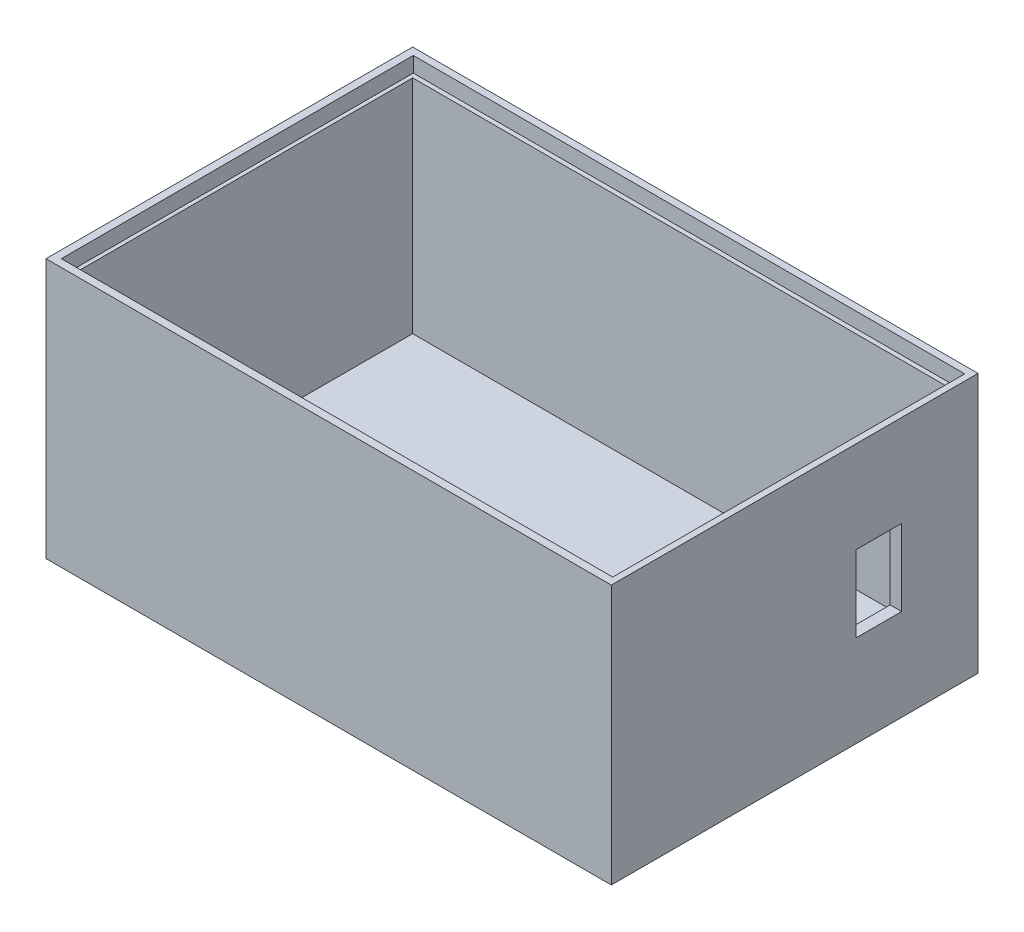
ISO-10303-21;
HEADER;
FILE_DESCRIPTION(('STEP AP214'),'2;1');
FILE_NAME('part.step','',(''),(''),'','','');
FILE_SCHEMA(('AUTOMOTIVE_DESIGN { 1 0 10303 214 1 1 1 1 }'));
ENDSEC;
DATA;
#1=APPLICATION_CONTEXT('core data for automotive mechanical design processes');
#2=APPLICATION_PROTOCOL_DEFINITION('international standard','automotive_design',2000,#1);
#3=PRODUCT_CONTEXT('',#1,'mechanical');
#4=PRODUCT('Part','Part','',(#3));
#5=PRODUCT_RELATED_PRODUCT_CATEGORY('part','',(#4));
#6=PRODUCT_DEFINITION_FORMATION('','',#4);
#7=PRODUCT_DEFINITION_CONTEXT('part definition',#1,'design');
#8=PRODUCT_DEFINITION('design','',#6,#7);
#9=PRODUCT_DEFINITION_SHAPE('','',#8);
#10=(LENGTH_UNIT() NAMED_UNIT(*) SI_UNIT(.MILLI.,.METRE.));
#11=(NAMED_UNIT(*) PLANE_ANGLE_UNIT() SI_UNIT($,.RADIAN.));
#12=(NAMED_UNIT(*) SI_UNIT($,.STERADIAN.) SOLID_ANGLE_UNIT());
#13=UNCERTAINTY_MEASURE_WITH_UNIT(LENGTH_MEASURE(1.E-05),#10,'distance_accuracy_value','');
#14=(GEOMETRIC_REPRESENTATION_CONTEXT(3) GLOBAL_UNCERTAINTY_ASSIGNED_CONTEXT((#13)) GLOBAL_UNIT_ASSIGNED_CONTEXT((#10,
#11,#12)) REPRESENTATION_CONTEXT('',''));
#15=CARTESIAN_POINT('',(0.,0.,0.));
#16=DIRECTION('',(0.,0.,1.));
#17=DIRECTION('',(1.,0.,0.));
#18=AXIS2_PLACEMENT_3D('',#15,#16,#17);
#19=CARTESIAN_POINT('',(37.,34.,24.));
#20=DIRECTION('',(-1.,0.,0.));
#21=DIRECTION('',(0.,0.,1.));
#22=AXIS2_PLACEMENT_3D('',#19,#20,#21);
#23=PLANE('',#22);
#24=DIRECTION('',(0.,0.,-1.));
#25=VECTOR('',#24,1.);
#26=CARTESIAN_POINT('',(37.,12.,-8.));
#27=LINE('',#26,#25);
#28=CARTESIAN_POINT('',(37.,12.,-8.));
#29=VERTEX_POINT('',#28);
#30=CARTESIAN_POINT('',(37.,12.,-14.));
#31=VERTEX_POINT('',#30);
#32=EDGE_CURVE('E165',#29,#31,#27,.T.);
#33=ORIENTED_EDGE('',*,*,#32,.F.);
#34=DIRECTION('',(0.,-1.,0.));
#35=VECTOR('',#34,1.);
#36=CARTESIAN_POINT('',(37.,22.,-8.));
#37=LINE('',#36,#35);
#38=CARTESIAN_POINT('',(37.,22.,-8.));
#39=VERTEX_POINT('',#38);
#40=EDGE_CURVE('E55',#39,#29,#37,.T.);
#41=ORIENTED_EDGE('',*,*,#40,.F.);
#42=DIRECTION('',(0.,0.,1.));
#43=VECTOR('',#42,1.);
#44=CARTESIAN_POINT('',(37.,22.,-8.));
#45=LINE('',#44,#43);
#46=CARTESIAN_POINT('',(37.,22.,-14.));
#47=VERTEX_POINT('',#46);
#48=EDGE_CURVE('E169',#47,#39,#45,.T.);
#49=ORIENTED_EDGE('',*,*,#48,.F.);
#50=DIRECTION('',(0.,1.,0.));
#51=VECTOR('',#50,1.);
#52=CARTESIAN_POINT('',(37.,22.,-14.));
#53=LINE('',#52,#51);
#54=EDGE_CURVE('E153',#31,#47,#53,.T.);
#55=ORIENTED_EDGE('',*,*,#54,.F.);
#56=EDGE_LOOP('',(#33,#41,#49,#55));
#57=FACE_BOUND('',#56,.T.);
#58=DIRECTION('',(0.,0.,-1.));
#59=VECTOR('',#58,1.);
#60=CARTESIAN_POINT('',(37.,0.,24.));
#61=LINE('',#60,#59);
#62=CARTESIAN_POINT('',(37.,0.,24.));
#63=VERTEX_POINT('',#62);
#64=CARTESIAN_POINT('',(37.,0.,-24.));
#65=VERTEX_POINT('',#64);
#66=EDGE_CURVE('E233',#63,#65,#61,.T.);
#67=ORIENTED_EDGE('',*,*,#66,.T.);
#68=DIRECTION('',(0.,-1.,0.));
#69=VECTOR('',#68,1.);
#70=CARTESIAN_POINT('',(37.,34.,-24.));
#71=LINE('',#70,#69);
#72=CARTESIAN_POINT('',(37.,34.,-24.));
#73=VERTEX_POINT('',#72);
#74=EDGE_CURVE('E267',#73,#65,#71,.T.);
#75=ORIENTED_EDGE('',*,*,#74,.F.);
#76=DIRECTION('',(0.,0.,-1.));
#77=VECTOR('',#76,1.);
#78=CARTESIAN_POINT('',(37.,34.,24.));
#79=LINE('',#78,#77);
#80=CARTESIAN_POINT('',(37.,34.,24.));
#81=VERTEX_POINT('',#80);
#82=EDGE_CURVE('E242',#81,#73,#79,.T.);
#83=ORIENTED_EDGE('',*,*,#82,.F.);
#84=DIRECTION('',(0.,-1.,0.));
#85=VECTOR('',#84,1.);
#86=CARTESIAN_POINT('',(37.,34.,24.));
#87=LINE('',#86,#85);
#88=EDGE_CURVE('E251',#81,#63,#87,.T.);
#89=ORIENTED_EDGE('',*,*,#88,.T.);
#90=EDGE_LOOP('',(#67,#75,#83,#89));
#91=FACE_BOUND('',#90,.T.);
#92=ADVANCED_FACE('F36',(#57,#91),#23,.F.);
#93=CARTESIAN_POINT('',(-37.,34.,-24.));
#94=DIRECTION('',(0.,0.,1.));
#95=DIRECTION('',(1.,0.,0.));
#96=AXIS2_PLACEMENT_3D('',#93,#94,#95);
#97=PLANE('',#96);
#98=DIRECTION('',(-1.,0.,0.));
#99=VECTOR('',#98,1.);
#100=CARTESIAN_POINT('',(-37.,0.,-24.));
#101=LINE('',#100,#99);
#102=CARTESIAN_POINT('',(-37.,0.,-24.));
#103=VERTEX_POINT('',#102);
#104=EDGE_CURVE('E258',#65,#103,#101,.T.);
#105=ORIENTED_EDGE('',*,*,#104,.T.);
#106=DIRECTION('',(0.,-1.,0.));
#107=VECTOR('',#106,1.);
#108=CARTESIAN_POINT('',(-37.,34.,-24.));
#109=LINE('',#108,#107);
#110=CARTESIAN_POINT('',(-37.,34.,-24.));
#111=VERTEX_POINT('',#110);
#112=EDGE_CURVE('E266',#111,#103,#109,.T.);
#113=ORIENTED_EDGE('',*,*,#112,.F.);
#114=DIRECTION('',(-1.,0.,0.));
#115=VECTOR('',#114,1.);
#116=CARTESIAN_POINT('',(-37.,34.,-24.));
#117=LINE('',#116,#115);
#118=EDGE_CURVE('E247',#73,#111,#117,.T.);
#119=ORIENTED_EDGE('',*,*,#118,.F.);
#120=ORIENTED_EDGE('',*,*,#74,.T.);
#121=EDGE_LOOP('',(#105,#113,#119,#120));
#122=FACE_BOUND('',#121,.T.);
#123=ADVANCED_FACE('F300',(#122),#97,.F.);
#124=CARTESIAN_POINT('',(-37.,34.,24.));
#125=DIRECTION('',(1.,0.,0.));
#126=DIRECTION('',(0.,0.,-1.));
#127=AXIS2_PLACEMENT_3D('',#124,#125,#126);
#128=PLANE('',#127);
#129=DIRECTION('',(0.,0.,1.));
#130=VECTOR('',#129,1.);
#131=CARTESIAN_POINT('',(-37.,0.,24.));
#132=LINE('',#131,#130);
#133=CARTESIAN_POINT('',(-37.,0.,24.));
#134=VERTEX_POINT('',#133);
#135=EDGE_CURVE('E256',#103,#134,#132,.T.);
#136=ORIENTED_EDGE('',*,*,#135,.T.);
#137=DIRECTION('',(0.,-1.,0.));
#138=VECTOR('',#137,1.);
#139=CARTESIAN_POINT('',(-37.,34.,24.));
#140=LINE('',#139,#138);
#141=CARTESIAN_POINT('',(-37.,34.,24.));
#142=VERTEX_POINT('',#141);
#143=EDGE_CURVE('E263',#142,#134,#140,.T.);
#144=ORIENTED_EDGE('',*,*,#143,.F.);
#145=DIRECTION('',(0.,0.,1.));
#146=VECTOR('',#145,1.);
#147=CARTESIAN_POINT('',(-37.,34.,24.));
#148=LINE('',#147,#146);
#149=EDGE_CURVE('E246',#111,#142,#148,.T.);
#150=ORIENTED_EDGE('',*,*,#149,.F.);
#151=ORIENTED_EDGE('',*,*,#112,.T.);
#152=EDGE_LOOP('',(#136,#144,#150,#151));
#153=FACE_BOUND('',#152,.T.);
#154=ADVANCED_FACE('F305',(#153),#128,.F.);
#155=CARTESIAN_POINT('',(-37.,34.,24.));
#156=DIRECTION('',(0.,0.,-1.));
#157=DIRECTION('',(-1.,0.,0.));
#158=AXIS2_PLACEMENT_3D('',#155,#156,#157);
#159=PLANE('',#158);
#160=DIRECTION('',(1.,0.,0.));
#161=VECTOR('',#160,1.);
#162=CARTESIAN_POINT('',(-37.,0.,24.));
#163=LINE('',#162,#161);
#164=EDGE_CURVE('E250',#134,#63,#163,.T.);
#165=ORIENTED_EDGE('',*,*,#164,.T.);
#166=ORIENTED_EDGE('',*,*,#88,.F.);
#167=DIRECTION('',(1.,0.,0.));
#168=VECTOR('',#167,1.);
#169=CARTESIAN_POINT('',(-37.,34.,24.));
#170=LINE('',#169,#168);
#171=EDGE_CURVE('E253',#142,#81,#170,.T.);
#172=ORIENTED_EDGE('',*,*,#171,.F.);
#173=ORIENTED_EDGE('',*,*,#143,.T.);
#174=EDGE_LOOP('',(#165,#166,#172,#173));
#175=FACE_BOUND('',#174,.T.);
#176=ADVANCED_FACE('F307',(#175),#159,.F.);
#177=CARTESIAN_POINT('',(0.,34.,0.));
#178=DIRECTION('',(0.,-1.,0.));
#179=DIRECTION('',(0.,0.,-1.));
#180=AXIS2_PLACEMENT_3D('',#177,#178,#179);
#181=PLANE('',#180);
#182=DIRECTION('',(1.,0.,0.));
#183=VECTOR('',#182,1.);
#184=CARTESIAN_POINT('',(-36.,34.,23.));
#185=LINE('',#184,#183);
#186=CARTESIAN_POINT('',(-36.,34.,23.));
#187=VERTEX_POINT('',#186);
#188=CARTESIAN_POINT('',(36.1855355612655,34.,23.));
#189=VERTEX_POINT('',#188);
#190=EDGE_CURVE('E194',#187,#189,#185,.T.);
#191=ORIENTED_EDGE('',*,*,#190,.F.);
#192=DIRECTION('',(0.,0.,1.));
#193=VECTOR('',#192,1.);
#194=CARTESIAN_POINT('',(-36.,34.,23.));
#195=LINE('',#194,#193);
#196=CARTESIAN_POINT('',(-36.,34.,-23.0800933434018));
#197=VERTEX_POINT('',#196);
#198=EDGE_CURVE('E174',#197,#187,#195,.T.);
#199=ORIENTED_EDGE('',*,*,#198,.F.);
#200=DIRECTION('',(-1.,0.,0.));
#201=VECTOR('',#200,1.);
#202=CARTESIAN_POINT('',(-36.,34.,-23.0800933434018));
#203=LINE('',#202,#201);
#204=CARTESIAN_POINT('',(36.1855355612655,34.,-23.0800933434018));
#205=VERTEX_POINT('',#204);
#206=EDGE_CURVE('E185',#205,#197,#203,.T.);
#207=ORIENTED_EDGE('',*,*,#206,.F.);
#208=DIRECTION('',(0.,0.,-1.));
#209=VECTOR('',#208,1.);
#210=CARTESIAN_POINT('',(36.1855355612655,34.,23.));
#211=LINE('',#210,#209);
#212=EDGE_CURVE('E198',#189,#205,#211,.T.);
#213=ORIENTED_EDGE('',*,*,#212,.F.);
#214=EDGE_LOOP('',(#191,#199,#207,#213));
#215=FACE_BOUND('',#214,.T.);
#216=ORIENTED_EDGE('',*,*,#82,.T.);
#217=ORIENTED_EDGE('',*,*,#118,.T.);
#218=ORIENTED_EDGE('',*,*,#149,.T.);
#219=ORIENTED_EDGE('',*,*,#171,.T.);
#220=EDGE_LOOP('',(#216,#217,#218,#219));
#221=FACE_BOUND('',#220,.T.);
#222=ADVANCED_FACE('F311',(#215,#221),#181,.F.);
#223=CARTESIAN_POINT('',(0.,0.,0.));
#224=DIRECTION('',(0.,-1.,0.));
#225=DIRECTION('',(0.,0.,-1.));
#226=AXIS2_PLACEMENT_3D('',#223,#224,#225);
#227=PLANE('',#226);
#228=ORIENTED_EDGE('',*,*,#66,.F.);
#229=ORIENTED_EDGE('',*,*,#164,.F.);
#230=ORIENTED_EDGE('',*,*,#135,.F.);
#231=ORIENTED_EDGE('',*,*,#104,.F.);
#232=EDGE_LOOP('',(#228,#229,#230,#231));
#233=FACE_BOUND('',#232,.T.);
#234=ADVANCED_FACE('F312',(#233),#227,.T.);
#235=CARTESIAN_POINT('',(0.,32.,0.));
#236=DIRECTION('',(0.,-1.,0.));
#237=DIRECTION('',(0.,0.,-1.));
#238=AXIS2_PLACEMENT_3D('',#235,#236,#237);
#239=PLANE('',#238);
#240=DIRECTION('',(0.,0.,1.));
#241=VECTOR('',#240,1.);
#242=CARTESIAN_POINT('',(-36.,32.,23.));
#243=LINE('',#242,#241);
#244=CARTESIAN_POINT('',(-36.,32.,-23.0800933434018));
#245=VERTEX_POINT('',#244);
#246=CARTESIAN_POINT('',(-36.,32.,23.));
#247=VERTEX_POINT('',#246);
#248=EDGE_CURVE('E180',#245,#247,#243,.T.);
#249=ORIENTED_EDGE('',*,*,#248,.T.);
#250=DIRECTION('',(1.,0.,0.));
#251=VECTOR('',#250,1.);
#252=CARTESIAN_POINT('',(-36.,32.,23.));
#253=LINE('',#252,#251);
#254=CARTESIAN_POINT('',(36.1855355612655,32.,23.));
#255=VERTEX_POINT('',#254);
#256=EDGE_CURVE('E182',#247,#255,#253,.T.);
#257=ORIENTED_EDGE('',*,*,#256,.T.);
#258=DIRECTION('',(0.,0.,-1.));
#259=VECTOR('',#258,1.);
#260=CARTESIAN_POINT('',(36.1855355612655,32.,23.));
#261=LINE('',#260,#259);
#262=CARTESIAN_POINT('',(36.1855355612655,32.,-23.0800933434018));
#263=VERTEX_POINT('',#262);
#264=EDGE_CURVE('E183',#255,#263,#261,.T.);
#265=ORIENTED_EDGE('',*,*,#264,.T.);
#266=DIRECTION('',(-1.,0.,0.));
#267=VECTOR('',#266,1.);
#268=CARTESIAN_POINT('',(-36.,32.,-23.0800933434018));
#269=LINE('',#268,#267);
#270=EDGE_CURVE('E187',#263,#245,#269,.T.);
#271=ORIENTED_EDGE('',*,*,#270,.T.);
#272=EDGE_LOOP('',(#249,#257,#265,#271));
#273=FACE_BOUND('',#272,.T.);
#274=DIRECTION('',(1.,0.,0.));
#275=VECTOR('',#274,1.);
#276=CARTESIAN_POINT('',(-35.5,32.,22.5));
#277=LINE('',#276,#275);
#278=CARTESIAN_POINT('',(-35.5,32.,22.5));
#279=VERTEX_POINT('',#278);
#280=CARTESIAN_POINT('',(35.5,32.,22.5));
#281=VERTEX_POINT('',#280);
#282=EDGE_CURVE('E215',#279,#281,#277,.T.);
#283=ORIENTED_EDGE('',*,*,#282,.F.);
#284=DIRECTION('',(0.,0.,1.));
#285=VECTOR('',#284,1.);
#286=CARTESIAN_POINT('',(-35.5,32.,22.5));
#287=LINE('',#286,#285);
#288=CARTESIAN_POINT('',(-35.5,32.,-22.5));
#289=VERTEX_POINT('',#288);
#290=EDGE_CURVE('E201',#289,#279,#287,.T.);
#291=ORIENTED_EDGE('',*,*,#290,.F.);
#292=DIRECTION('',(-1.,0.,0.));
#293=VECTOR('',#292,1.);
#294=CARTESIAN_POINT('',(-35.5,32.,-22.5));
#295=LINE('',#294,#293);
#296=CARTESIAN_POINT('',(35.5,32.,-22.5));
#297=VERTEX_POINT('',#296);
#298=EDGE_CURVE('E275',#297,#289,#295,.T.);
#299=ORIENTED_EDGE('',*,*,#298,.F.);
#300=DIRECTION('',(0.,0.,-1.));
#301=VECTOR('',#300,1.);
#302=CARTESIAN_POINT('',(35.5,32.,22.5));
#303=LINE('',#302,#301);
#304=EDGE_CURVE('E214',#281,#297,#303,.T.);
#305=ORIENTED_EDGE('',*,*,#304,.F.);
#306=EDGE_LOOP('',(#283,#291,#299,#305));
#307=FACE_BOUND('',#306,.T.);
#308=ADVANCED_FACE('F318',(#273,#307),#239,.F.);
#309=CARTESIAN_POINT('',(-36.,32.,23.));
#310=DIRECTION('',(-1.,0.,0.));
#311=DIRECTION('',(0.,0.,1.));
#312=AXIS2_PLACEMENT_3D('',#309,#310,#311);
#313=PLANE('',#312);
#314=ORIENTED_EDGE('',*,*,#198,.T.);
#315=DIRECTION('',(0.,1.,0.));
#316=VECTOR('',#315,1.);
#317=CARTESIAN_POINT('',(-36.,32.,23.));
#318=LINE('',#317,#316);
#319=EDGE_CURVE('E192',#247,#187,#318,.T.);
#320=ORIENTED_EDGE('',*,*,#319,.F.);
#321=ORIENTED_EDGE('',*,*,#248,.F.);
#322=DIRECTION('',(0.,1.,0.));
#323=VECTOR('',#322,1.);
#324=CARTESIAN_POINT('',(-36.,32.,-23.0800933434018));
#325=LINE('',#324,#323);
#326=EDGE_CURVE('E203',#245,#197,#325,.T.);
#327=ORIENTED_EDGE('',*,*,#326,.T.);
#328=EDGE_LOOP('',(#314,#320,#321,#327));
#329=FACE_BOUND('',#328,.T.);
#330=ADVANCED_FACE('F337',(#329),#313,.F.);
#331=CARTESIAN_POINT('',(-36.,32.,-23.0800933434018));
#332=DIRECTION('',(0.,0.,-1.));
#333=DIRECTION('',(-1.,0.,0.));
#334=AXIS2_PLACEMENT_3D('',#331,#332,#333);
#335=PLANE('',#334);
#336=ORIENTED_EDGE('',*,*,#206,.T.);
#337=ORIENTED_EDGE('',*,*,#326,.F.);
#338=ORIENTED_EDGE('',*,*,#270,.F.);
#339=DIRECTION('',(0.,1.,0.));
#340=VECTOR('',#339,1.);
#341=CARTESIAN_POINT('',(36.1855355612655,32.,-23.0800933434018));
#342=LINE('',#341,#340);
#343=EDGE_CURVE('E204',#263,#205,#342,.T.);
#344=ORIENTED_EDGE('',*,*,#343,.T.);
#345=EDGE_LOOP('',(#336,#337,#338,#344));
#346=FACE_BOUND('',#345,.T.);
#347=ADVANCED_FACE('F344',(#346),#335,.F.);
#348=CARTESIAN_POINT('',(36.1855355612655,32.,23.));
#349=DIRECTION('',(1.,0.,0.));
#350=DIRECTION('',(0.,0.,-1.));
#351=AXIS2_PLACEMENT_3D('',#348,#349,#350);
#352=PLANE('',#351);
#353=ORIENTED_EDGE('',*,*,#212,.T.);
#354=ORIENTED_EDGE('',*,*,#343,.F.);
#355=ORIENTED_EDGE('',*,*,#264,.F.);
#356=DIRECTION('',(0.,1.,0.));
#357=VECTOR('',#356,1.);
#358=CARTESIAN_POINT('',(36.1855355612655,32.,23.));
#359=LINE('',#358,#357);
#360=EDGE_CURVE('E206',#255,#189,#359,.T.);
#361=ORIENTED_EDGE('',*,*,#360,.T.);
#362=EDGE_LOOP('',(#353,#354,#355,#361));
#363=FACE_BOUND('',#362,.T.);
#364=ADVANCED_FACE('F342',(#363),#352,.F.);
#365=CARTESIAN_POINT('',(-36.,32.,23.));
#366=DIRECTION('',(0.,0.,1.));
#367=DIRECTION('',(1.,0.,0.));
#368=AXIS2_PLACEMENT_3D('',#365,#366,#367);
#369=PLANE('',#368);
#370=ORIENTED_EDGE('',*,*,#190,.T.);
#371=ORIENTED_EDGE('',*,*,#360,.F.);
#372=ORIENTED_EDGE('',*,*,#256,.F.);
#373=ORIENTED_EDGE('',*,*,#319,.T.);
#374=EDGE_LOOP('',(#370,#371,#372,#373));
#375=FACE_BOUND('',#374,.T.);
#376=ADVANCED_FACE('F336',(#375),#369,.F.);
#377=CARTESIAN_POINT('',(0.,3.,0.));
#378=DIRECTION('',(0.,-1.,0.));
#379=DIRECTION('',(0.,0.,-1.));
#380=AXIS2_PLACEMENT_3D('',#377,#378,#379);
#381=PLANE('',#380);
#382=DIRECTION('',(0.,0.,-1.));
#383=VECTOR('',#382,1.);
#384=CARTESIAN_POINT('',(35.5,3.,22.5));
#385=LINE('',#384,#383);
#386=CARTESIAN_POINT('',(35.5,3.,22.5));
#387=VERTEX_POINT('',#386);
#388=CARTESIAN_POINT('',(35.5,3.,-22.5));
#389=VERTEX_POINT('',#388);
#390=EDGE_CURVE('E217',#387,#389,#385,.T.);
#391=ORIENTED_EDGE('',*,*,#390,.T.);
#392=DIRECTION('',(-1.,0.,0.));
#393=VECTOR('',#392,1.);
#394=CARTESIAN_POINT('',(-35.5,3.,-22.5));
#395=LINE('',#394,#393);
#396=CARTESIAN_POINT('',(-35.5,3.,-22.5));
#397=VERTEX_POINT('',#396);
#398=EDGE_CURVE('E222',#389,#397,#395,.T.);
#399=ORIENTED_EDGE('',*,*,#398,.T.);
#400=DIRECTION('',(0.,0.,1.));
#401=VECTOR('',#400,1.);
#402=CARTESIAN_POINT('',(-35.5,3.,22.5));
#403=LINE('',#402,#401);
#404=CARTESIAN_POINT('',(-35.5,3.,22.5));
#405=VERTEX_POINT('',#404);
#406=EDGE_CURVE('E221',#397,#405,#403,.T.);
#407=ORIENTED_EDGE('',*,*,#406,.T.);
#408=DIRECTION('',(1.,0.,0.));
#409=VECTOR('',#408,1.);
#410=CARTESIAN_POINT('',(-35.5,3.,22.5));
#411=LINE('',#410,#409);
#412=EDGE_CURVE('E230',#405,#387,#411,.T.);
#413=ORIENTED_EDGE('',*,*,#412,.T.);
#414=EDGE_LOOP('',(#391,#399,#407,#413));
#415=FACE_BOUND('',#414,.T.);
#416=ADVANCED_FACE('F330',(#415),#381,.F.);
#417=CARTESIAN_POINT('',(-35.5,3.,-22.5));
#418=DIRECTION('',(0.,0.,-1.));
#419=DIRECTION('',(-1.,0.,0.));
#420=AXIS2_PLACEMENT_3D('',#417,#418,#419);
#421=PLANE('',#420);
#422=DIRECTION('',(0.,1.,0.));
#423=VECTOR('',#422,1.);
#424=CARTESIAN_POINT('',(35.5,3.,-22.5));
#425=LINE('',#424,#423);
#426=EDGE_CURVE('E229',#389,#297,#425,.T.);
#427=ORIENTED_EDGE('',*,*,#426,.T.);
#428=ORIENTED_EDGE('',*,*,#298,.T.);
#429=DIRECTION('',(0.,1.,0.));
#430=VECTOR('',#429,1.);
#431=CARTESIAN_POINT('',(-35.5,3.,-22.5));
#432=LINE('',#431,#430);
#433=EDGE_CURVE('E236',#397,#289,#432,.T.);
#434=ORIENTED_EDGE('',*,*,#433,.F.);
#435=ORIENTED_EDGE('',*,*,#398,.F.);
#436=EDGE_LOOP('',(#427,#428,#434,#435));
#437=FACE_BOUND('',#436,.T.);
#438=ADVANCED_FACE('F323',(#437),#421,.F.);
#439=CARTESIAN_POINT('',(-35.5,3.,22.5));
#440=DIRECTION('',(-1.,0.,0.));
#441=DIRECTION('',(0.,0.,1.));
#442=AXIS2_PLACEMENT_3D('',#439,#440,#441);
#443=PLANE('',#442);
#444=ORIENTED_EDGE('',*,*,#433,.T.);
#445=ORIENTED_EDGE('',*,*,#290,.T.);
#446=DIRECTION('',(0.,1.,0.));
#447=VECTOR('',#446,1.);
#448=CARTESIAN_POINT('',(-35.5,3.,22.5));
#449=LINE('',#448,#447);
#450=EDGE_CURVE('E232',#405,#279,#449,.T.);
#451=ORIENTED_EDGE('',*,*,#450,.F.);
#452=ORIENTED_EDGE('',*,*,#406,.F.);
#453=EDGE_LOOP('',(#444,#445,#451,#452));
#454=FACE_BOUND('',#453,.T.);
#455=ADVANCED_FACE('F326',(#454),#443,.F.);
#456=CARTESIAN_POINT('',(-35.5,3.,22.5));
#457=DIRECTION('',(0.,0.,1.));
#458=DIRECTION('',(1.,0.,0.));
#459=AXIS2_PLACEMENT_3D('',#456,#457,#458);
#460=PLANE('',#459);
#461=ORIENTED_EDGE('',*,*,#450,.T.);
#462=ORIENTED_EDGE('',*,*,#282,.T.);
#463=DIRECTION('',(0.,1.,0.));
#464=VECTOR('',#463,1.);
#465=CARTESIAN_POINT('',(35.5,3.,22.5));
#466=LINE('',#465,#464);
#467=EDGE_CURVE('E234',#387,#281,#466,.T.);
#468=ORIENTED_EDGE('',*,*,#467,.F.);
#469=ORIENTED_EDGE('',*,*,#412,.F.);
#470=EDGE_LOOP('',(#461,#462,#468,#469));
#471=FACE_BOUND('',#470,.T.);
#472=ADVANCED_FACE('F295',(#471),#460,.F.);
#473=CARTESIAN_POINT('',(35.5,3.,22.5));
#474=DIRECTION('',(1.,0.,0.));
#475=DIRECTION('',(0.,0.,-1.));
#476=AXIS2_PLACEMENT_3D('',#473,#474,#475);
#477=PLANE('',#476);
#478=DIRECTION('',(0.,0.,1.));
#479=VECTOR('',#478,1.);
#480=CARTESIAN_POINT('',(35.5,22.,22.5));
#481=LINE('',#480,#479);
#482=CARTESIAN_POINT('',(35.5,22.,-14.));
#483=VERTEX_POINT('',#482);
#484=CARTESIAN_POINT('',(35.5,22.,-8.));
#485=VERTEX_POINT('',#484);
#486=EDGE_CURVE('E44',#483,#485,#481,.T.);
#487=ORIENTED_EDGE('',*,*,#486,.T.);
#488=DIRECTION('',(0.,-1.,0.));
#489=VECTOR('',#488,1.);
#490=CARTESIAN_POINT('',(35.5,3.,-8.));
#491=LINE('',#490,#489);
#492=CARTESIAN_POINT('',(35.5,12.,-8.));
#493=VERTEX_POINT('',#492);
#494=EDGE_CURVE('E11',#485,#493,#491,.T.);
#495=ORIENTED_EDGE('',*,*,#494,.T.);
#496=DIRECTION('',(0.,0.,-1.));
#497=VECTOR('',#496,1.);
#498=CARTESIAN_POINT('',(35.5,12.,22.5));
#499=LINE('',#498,#497);
#500=CARTESIAN_POINT('',(35.5,12.,-14.));
#501=VERTEX_POINT('',#500);
#502=EDGE_CURVE('E274',#493,#501,#499,.T.);
#503=ORIENTED_EDGE('',*,*,#502,.T.);
#504=DIRECTION('',(0.,1.,0.));
#505=VECTOR('',#504,1.);
#506=CARTESIAN_POINT('',(35.5,3.,-14.));
#507=LINE('',#506,#505);
#508=EDGE_CURVE('E156',#501,#483,#507,.T.);
#509=ORIENTED_EDGE('',*,*,#508,.T.);
#510=EDGE_LOOP('',(#487,#495,#503,#509));
#511=FACE_BOUND('',#510,.T.);
#512=ORIENTED_EDGE('',*,*,#467,.T.);
#513=ORIENTED_EDGE('',*,*,#304,.T.);
#514=ORIENTED_EDGE('',*,*,#426,.F.);
#515=ORIENTED_EDGE('',*,*,#390,.F.);
#516=EDGE_LOOP('',(#512,#513,#514,#515));
#517=FACE_BOUND('',#516,.T.);
#518=ADVANCED_FACE('F276',(#511,#517),#477,.F.);
#519=CARTESIAN_POINT('',(32.,22.,-8.));
#520=DIRECTION('',(0.,0.,1.));
#521=DIRECTION('',(1.,0.,0.));
#522=AXIS2_PLACEMENT_3D('',#519,#520,#521);
#523=PLANE('',#522);
#524=DIRECTION('',(1.,0.,0.));
#525=VECTOR('',#524,1.);
#526=CARTESIAN_POINT('',(32.,22.,-8.));
#527=LINE('',#526,#525);
#528=EDGE_CURVE('E172',#485,#39,#527,.T.);
#529=ORIENTED_EDGE('',*,*,#528,.T.);
#530=ORIENTED_EDGE('',*,*,#40,.T.);
#531=DIRECTION('',(1.,0.,0.));
#532=VECTOR('',#531,1.);
#533=CARTESIAN_POINT('',(32.,12.,-8.));
#534=LINE('',#533,#532);
#535=EDGE_CURVE('E157',#493,#29,#534,.T.);
#536=ORIENTED_EDGE('',*,*,#535,.F.);
#537=ORIENTED_EDGE('',*,*,#494,.F.);
#538=EDGE_LOOP('',(#529,#530,#536,#537));
#539=FACE_BOUND('',#538,.T.);
#540=ADVANCED_FACE('F283',(#539),#523,.F.);
#541=CARTESIAN_POINT('',(32.,22.,-8.));
#542=DIRECTION('',(0.,1.,0.));
#543=DIRECTION('',(0.,0.,1.));
#544=AXIS2_PLACEMENT_3D('',#541,#542,#543);
#545=PLANE('',#544);
#546=DIRECTION('',(1.,0.,0.));
#547=VECTOR('',#546,1.);
#548=CARTESIAN_POINT('',(32.,22.,-14.));
#549=LINE('',#548,#547);
#550=EDGE_CURVE('E158',#483,#47,#549,.T.);
#551=ORIENTED_EDGE('',*,*,#550,.T.);
#552=ORIENTED_EDGE('',*,*,#48,.T.);
#553=ORIENTED_EDGE('',*,*,#528,.F.);
#554=ORIENTED_EDGE('',*,*,#486,.F.);
#555=EDGE_LOOP('',(#551,#552,#553,#554));
#556=FACE_BOUND('',#555,.T.);
#557=ADVANCED_FACE('F282',(#556),#545,.F.);
#558=CARTESIAN_POINT('',(32.,22.,-14.));
#559=DIRECTION('',(0.,0.,-1.));
#560=DIRECTION('',(-1.,0.,0.));
#561=AXIS2_PLACEMENT_3D('',#558,#559,#560);
#562=PLANE('',#561);
#563=DIRECTION('',(1.,0.,0.));
#564=VECTOR('',#563,1.);
#565=CARTESIAN_POINT('',(32.,12.,-14.));
#566=LINE('',#565,#564);
#567=EDGE_CURVE('E58',#501,#31,#566,.T.);
#568=ORIENTED_EDGE('',*,*,#567,.T.);
#569=ORIENTED_EDGE('',*,*,#54,.T.);
#570=ORIENTED_EDGE('',*,*,#550,.F.);
#571=ORIENTED_EDGE('',*,*,#508,.F.);
#572=EDGE_LOOP('',(#568,#569,#570,#571));
#573=FACE_BOUND('',#572,.T.);
#574=ADVANCED_FACE('F147',(#573),#562,.F.);
#575=CARTESIAN_POINT('',(32.,12.,-8.));
#576=DIRECTION('',(0.,-1.,0.));
#577=DIRECTION('',(0.,0.,-1.));
#578=AXIS2_PLACEMENT_3D('',#575,#576,#577);
#579=PLANE('',#578);
#580=ORIENTED_EDGE('',*,*,#535,.T.);
#581=ORIENTED_EDGE('',*,*,#32,.T.);
#582=ORIENTED_EDGE('',*,*,#567,.F.);
#583=ORIENTED_EDGE('',*,*,#502,.F.);
#584=EDGE_LOOP('',(#580,#581,#582,#583));
#585=FACE_BOUND('',#584,.T.);
#586=ADVANCED_FACE('F162',(#585),#579,.F.);
#587=CLOSED_SHELL('',(#92,#123,#154,#176,#222,#234,#308,#330,#347,#364,#376,#416,#438,#455,#472,
#518,#540,#557,#574,#586));
#588=MANIFOLD_SOLID_BREP('B2',#587);
#589=ADVANCED_BREP_SHAPE_REPRESENTATION('',(#18,#588),#14);
#590=SHAPE_DEFINITION_REPRESENTATION(#9,#589);
ENDSEC;
END-ISO-10303-21;
